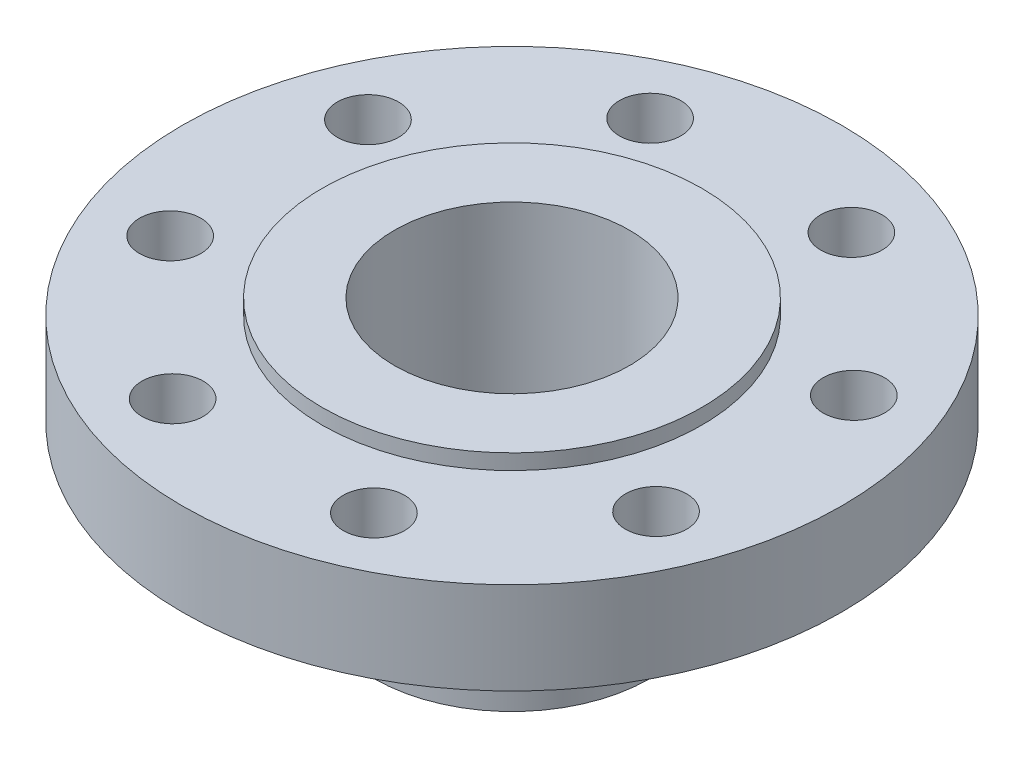
ISO-10303-21;
HEADER;
FILE_DESCRIPTION(('STEP AP214'),'2;1');
FILE_NAME('part.step','',(''),(''),'','','');
FILE_SCHEMA(('AUTOMOTIVE_DESIGN { 1 0 10303 214 1 1 1 1 }'));
ENDSEC;
DATA;
#1=APPLICATION_CONTEXT('core data for automotive mechanical design processes');
#2=APPLICATION_PROTOCOL_DEFINITION('international standard','automotive_design',2000,#1);
#3=PRODUCT_CONTEXT('',#1,'mechanical');
#4=PRODUCT('Part','Part','',(#3));
#5=PRODUCT_RELATED_PRODUCT_CATEGORY('part','',(#4));
#6=PRODUCT_DEFINITION_FORMATION('','',#4);
#7=PRODUCT_DEFINITION_CONTEXT('part definition',#1,'design');
#8=PRODUCT_DEFINITION('design','',#6,#7);
#9=PRODUCT_DEFINITION_SHAPE('','',#8);
#10=(LENGTH_UNIT() NAMED_UNIT(*) SI_UNIT(.MILLI.,.METRE.));
#11=(NAMED_UNIT(*) PLANE_ANGLE_UNIT() SI_UNIT($,.RADIAN.));
#12=(NAMED_UNIT(*) SI_UNIT($,.STERADIAN.) SOLID_ANGLE_UNIT());
#13=UNCERTAINTY_MEASURE_WITH_UNIT(LENGTH_MEASURE(1.E-05),#10,'distance_accuracy_value','');
#14=(GEOMETRIC_REPRESENTATION_CONTEXT(3) GLOBAL_UNCERTAINTY_ASSIGNED_CONTEXT((#13)) GLOBAL_UNIT_ASSIGNED_CONTEXT((#10,
#11,#12)) REPRESENTATION_CONTEXT('',''));
#15=CARTESIAN_POINT('',(0.,0.,0.));
#16=DIRECTION('',(0.,0.,1.));
#17=DIRECTION('',(1.,0.,0.));
#18=AXIS2_PLACEMENT_3D('',#15,#16,#17);
#19=CARTESIAN_POINT('',(57.15,0.,0.));
#20=DIRECTION('',(0.,1.,0.));
#21=DIRECTION('',(0.,0.,1.));
#22=AXIS2_PLACEMENT_3D('',#19,#20,#21);
#23=PLANE('',#22);
#24=CARTESIAN_POINT('',(0.,0.,0.));
#25=DIRECTION('',(0.,1.,0.));
#26=DIRECTION('',(0.,0.,1.));
#27=AXIS2_PLACEMENT_3D('',#24,#25,#26);
#28=CIRCLE('',#27,57.15);
#29=CARTESIAN_POINT('',(0.,0.,57.15));
#30=VERTEX_POINT('',#29);
#31=EDGE_CURVE('E70',#30,#30,#28,.T.);
#32=ORIENTED_EDGE('',*,*,#31,.F.);
#33=EDGE_LOOP('',(#32));
#34=FACE_BOUND('',#33,.T.);
#35=CARTESIAN_POINT('',(0.,0.,0.));
#36=DIRECTION('',(0.,1.,0.));
#37=DIRECTION('',(0.,0.,1.));
#38=AXIS2_PLACEMENT_3D('',#35,#36,#37);
#39=CIRCLE('',#38,48.64);
#40=CARTESIAN_POINT('',(0.,0.,48.64));
#41=VERTEX_POINT('',#40);
#42=EDGE_CURVE('E10',#41,#41,#39,.T.);
#43=ORIENTED_EDGE('',*,*,#42,.T.);
#44=EDGE_LOOP('',(#43));
#45=FACE_BOUND('',#44,.T.);
#46=ADVANCED_FACE('F31',(#34,#45),#23,.F.);
#47=CARTESIAN_POINT('',(0.,145.426192893401,0.));
#48=DIRECTION('',(0.,1.,0.));
#49=DIRECTION('',(0.,0.,1.));
#50=AXIS2_PLACEMENT_3D('',#47,#48,#49);
#51=CYLINDRICAL_SURFACE('',#50,48.64);
#52=ORIENTED_EDGE('',*,*,#42,.F.);
#53=EDGE_LOOP('',(#52));
#54=FACE_BOUND('',#53,.T.);
#55=CARTESIAN_POINT('',(0.,107.95,0.));
#56=DIRECTION('',(0.,1.,0.));
#57=DIRECTION('',(0.,0.,1.));
#58=AXIS2_PLACEMENT_3D('',#55,#56,#57);
#59=CIRCLE('',#58,48.64);
#60=CARTESIAN_POINT('',(0.,107.95,48.64));
#61=VERTEX_POINT('',#60);
#62=EDGE_CURVE('E38',#61,#61,#59,.T.);
#63=ORIENTED_EDGE('',*,*,#62,.T.);
#64=EDGE_LOOP('',(#63));
#65=FACE_BOUND('',#64,.T.);
#66=ADVANCED_FACE('F141',(#54,#65),#51,.F.);
#67=CARTESIAN_POINT('',(48.64,107.95,0.));
#68=DIRECTION('',(0.,-1.,0.));
#69=DIRECTION('',(0.,0.,-1.));
#70=AXIS2_PLACEMENT_3D('',#67,#68,#69);
#71=PLANE('',#70);
#72=ORIENTED_EDGE('',*,*,#62,.F.);
#73=EDGE_LOOP('',(#72));
#74=FACE_BOUND('',#73,.T.);
#75=CARTESIAN_POINT('',(0.,107.95,0.));
#76=DIRECTION('',(0.,1.,0.));
#77=DIRECTION('',(0.,0.,1.));
#78=AXIS2_PLACEMENT_3D('',#75,#76,#77);
#79=CIRCLE('',#78,78.615);
#80=CARTESIAN_POINT('',(0.,107.95,78.615));
#81=VERTEX_POINT('',#80);
#82=EDGE_CURVE('E43',#81,#81,#79,.T.);
#83=ORIENTED_EDGE('',*,*,#82,.T.);
#84=EDGE_LOOP('',(#83));
#85=FACE_BOUND('',#84,.T.);
#86=ADVANCED_FACE('F97',(#74,#85),#71,.F.);
#87=CARTESIAN_POINT('',(0.,145.426192893401,0.));
#88=DIRECTION('',(0.,1.,0.));
#89=DIRECTION('',(0.,0.,1.));
#90=AXIS2_PLACEMENT_3D('',#87,#88,#89);
#91=CYLINDRICAL_SURFACE('',#90,78.615);
#92=ORIENTED_EDGE('',*,*,#82,.F.);
#93=EDGE_LOOP('',(#92));
#94=FACE_BOUND('',#93,.T.);
#95=CARTESIAN_POINT('',(0.,101.6,0.));
#96=DIRECTION('',(0.,1.,0.));
#97=DIRECTION('',(0.,0.,1.));
#98=AXIS2_PLACEMENT_3D('',#95,#96,#97);
#99=CIRCLE('',#98,78.615);
#100=CARTESIAN_POINT('',(0.,101.6,78.615));
#101=VERTEX_POINT('',#100);
#102=EDGE_CURVE('E92',#101,#101,#99,.T.);
#103=ORIENTED_EDGE('',*,*,#102,.T.);
#104=EDGE_LOOP('',(#103));
#105=FACE_BOUND('',#104,.T.);
#106=ADVANCED_FACE('F99',(#94,#105),#91,.T.);
#107=CARTESIAN_POINT('',(78.615,101.6,0.));
#108=DIRECTION('',(0.,-1.,0.));
#109=DIRECTION('',(0.,0.,-1.));
#110=AXIS2_PLACEMENT_3D('',#107,#108,#109);
#111=PLANE('',#110);
#112=CARTESIAN_POINT('',(-100.089497100485,101.6,-40.4387817592463));
#113=DIRECTION('',(0.,1.,0.));
#114=DIRECTION('',(0.,0.,1.));
#115=AXIS2_PLACEMENT_3D('',#112,#113,#114);
#116=CIRCLE('',#115,12.7000000000027);
#117=CARTESIAN_POINT('',(-100.089497100485,101.6,-27.7387817592436));
#118=VERTEX_POINT('',#117);
#119=EDGE_CURVE('E262',#118,#118,#116,.T.);
#120=ORIENTED_EDGE('',*,*,#119,.F.);
#121=EDGE_LOOP('',(#120));
#122=FACE_BOUND('',#121,.T.);
#123=CARTESIAN_POINT('',(-99.3684989301908,101.6,42.1794253204198));
#124=DIRECTION('',(0.,1.,0.));
#125=DIRECTION('',(0.,0.,1.));
#126=AXIS2_PLACEMENT_3D('',#123,#124,#125);
#127=CIRCLE('',#126,12.7000000000036);
#128=CARTESIAN_POINT('',(-99.3684989301908,101.6,54.8794253204234));
#129=VERTEX_POINT('',#128);
#130=EDGE_CURVE('E263',#129,#129,#127,.T.);
#131=ORIENTED_EDGE('',*,*,#130,.F.);
#132=EDGE_LOOP('',(#131));
#133=FACE_BOUND('',#132,.T.);
#134=CARTESIAN_POINT('',(-40.4387817592463,101.6,100.089497100488));
#135=DIRECTION('',(0.,1.,0.));
#136=DIRECTION('',(0.,0.,1.));
#137=AXIS2_PLACEMENT_3D('',#134,#135,#136);
#138=CIRCLE('',#137,12.7000000000036);
#139=CARTESIAN_POINT('',(-40.4387817592463,101.6,112.789497100491));
#140=VERTEX_POINT('',#139);
#141=EDGE_CURVE('E265',#140,#140,#138,.T.);
#142=ORIENTED_EDGE('',*,*,#141,.F.);
#143=EDGE_LOOP('',(#142));
#144=FACE_BOUND('',#143,.T.);
#145=CARTESIAN_POINT('',(42.1794253204198,101.6,99.3684989301934));
#146=DIRECTION('',(0.,1.,0.));
#147=DIRECTION('',(0.,0.,1.));
#148=AXIS2_PLACEMENT_3D('',#145,#146,#147);
#149=CIRCLE('',#148,12.7000000000025);
#150=CARTESIAN_POINT('',(42.1794253204198,101.6,112.068498930196));
#151=VERTEX_POINT('',#150);
#152=EDGE_CURVE('E270',#151,#151,#149,.T.);
#153=ORIENTED_EDGE('',*,*,#152,.F.);
#154=EDGE_LOOP('',(#153));
#155=FACE_BOUND('',#154,.T.);
#156=CARTESIAN_POINT('',(100.089497100488,101.6,40.4387817592488));
#157=DIRECTION('',(0.,1.,0.));
#158=DIRECTION('',(0.,0.,1.));
#159=AXIS2_PLACEMENT_3D('',#156,#157,#158);
#160=CIRCLE('',#159,12.7000000000009);
#161=CARTESIAN_POINT('',(100.089497100488,101.6,53.1387817592498));
#162=VERTEX_POINT('',#161);
#163=EDGE_CURVE('E273',#162,#162,#160,.T.);
#164=ORIENTED_EDGE('',*,*,#163,.F.);
#165=EDGE_LOOP('',(#164));
#166=FACE_BOUND('',#165,.T.);
#167=CARTESIAN_POINT('',(99.3684989301935,101.6,-42.1794253204172));
#168=DIRECTION('',(0.,1.,0.));
#169=DIRECTION('',(0.,0.,1.));
#170=AXIS2_PLACEMENT_3D('',#167,#168,#169);
#171=CIRCLE('',#170,12.6999999999997);
#172=CARTESIAN_POINT('',(99.3684989301935,101.6,-29.4794253204176));
#173=VERTEX_POINT('',#172);
#174=EDGE_CURVE('E276',#173,#173,#171,.T.);
#175=ORIENTED_EDGE('',*,*,#174,.F.);
#176=EDGE_LOOP('',(#175));
#177=FACE_BOUND('',#176,.T.);
#178=CARTESIAN_POINT('',(40.4387817592489,101.6,-100.089497100485));
#179=DIRECTION('',(0.,1.,0.));
#180=DIRECTION('',(0.,0.,1.));
#181=AXIS2_PLACEMENT_3D('',#178,#179,#180);
#182=CIRCLE('',#181,12.6999999999993);
#183=CARTESIAN_POINT('',(40.4387817592489,101.6,-87.389497100486));
#184=VERTEX_POINT('',#183);
#185=EDGE_CURVE('E279',#184,#184,#182,.T.);
#186=ORIENTED_EDGE('',*,*,#185,.F.);
#187=EDGE_LOOP('',(#186));
#188=FACE_BOUND('',#187,.T.);
#189=CARTESIAN_POINT('',(-42.1794253204172,101.6,-99.3684989301909));
#190=DIRECTION('',(0.,1.,0.));
#191=DIRECTION('',(0.,0.,1.));
#192=AXIS2_PLACEMENT_3D('',#189,#190,#191);
#193=CIRCLE('',#192,12.7);
#194=CARTESIAN_POINT('',(-42.1794253204172,101.6,-86.6684989301909));
#195=VERTEX_POINT('',#194);
#196=EDGE_CURVE('E51',#195,#195,#193,.T.);
#197=ORIENTED_EDGE('',*,*,#196,.F.);
#198=EDGE_LOOP('',(#197));
#199=FACE_BOUND('',#198,.T.);
#200=ORIENTED_EDGE('',*,*,#102,.F.);
#201=EDGE_LOOP('',(#200));
#202=FACE_BOUND('',#201,.T.);
#203=CARTESIAN_POINT('',(0.,101.6,0.));
#204=DIRECTION('',(0.,1.,0.));
#205=DIRECTION('',(0.,0.,1.));
#206=AXIS2_PLACEMENT_3D('',#203,#204,#205);
#207=CIRCLE('',#206,136.525);
#208=CARTESIAN_POINT('',(0.,101.6,136.525));
#209=VERTEX_POINT('',#208);
#210=EDGE_CURVE('E89',#209,#209,#207,.T.);
#211=ORIENTED_EDGE('',*,*,#210,.T.);
#212=EDGE_LOOP('',(#211));
#213=FACE_BOUND('',#212,.T.);
#214=ADVANCED_FACE('F102',(#122,#133,#144,#155,#166,#177,#188,#199,#202,#213),#111,.F.);
#215=CARTESIAN_POINT('',(0.,145.426192893401,0.));
#216=DIRECTION('',(0.,1.,0.));
#217=DIRECTION('',(0.,0.,1.));
#218=AXIS2_PLACEMENT_3D('',#215,#216,#217);
#219=CYLINDRICAL_SURFACE('',#218,136.525);
#220=ORIENTED_EDGE('',*,*,#210,.F.);
#221=EDGE_LOOP('',(#220));
#222=FACE_BOUND('',#221,.T.);
#223=CARTESIAN_POINT('',(0.,63.5,0.));
#224=DIRECTION('',(0.,1.,0.));
#225=DIRECTION('',(0.,0.,1.));
#226=AXIS2_PLACEMENT_3D('',#223,#224,#225);
#227=CIRCLE('',#226,136.525);
#228=CARTESIAN_POINT('',(0.,63.5,136.525));
#229=VERTEX_POINT('',#228);
#230=EDGE_CURVE('E86',#229,#229,#227,.T.);
#231=ORIENTED_EDGE('',*,*,#230,.T.);
#232=EDGE_LOOP('',(#231));
#233=FACE_BOUND('',#232,.T.);
#234=ADVANCED_FACE('F108',(#222,#233),#219,.T.);
#235=CARTESIAN_POINT('',(136.525,63.5,0.));
#236=DIRECTION('',(0.,1.,0.));
#237=DIRECTION('',(0.,0.,1.));
#238=AXIS2_PLACEMENT_3D('',#235,#236,#237);
#239=PLANE('',#238);
#240=CARTESIAN_POINT('',(-100.089497100485,63.5,-40.4387817592463));
#241=DIRECTION('',(0.,1.,0.));
#242=DIRECTION('',(0.,0.,1.));
#243=AXIS2_PLACEMENT_3D('',#240,#241,#242);
#244=CIRCLE('',#243,12.7000000000027);
#245=CARTESIAN_POINT('',(-100.089497100485,63.5,-27.7387817592436));
#246=VERTEX_POINT('',#245);
#247=EDGE_CURVE('E34',#246,#246,#244,.T.);
#248=ORIENTED_EDGE('',*,*,#247,.T.);
#249=EDGE_LOOP('',(#248));
#250=FACE_BOUND('',#249,.T.);
#251=CARTESIAN_POINT('',(-99.3684989301908,63.5,42.1794253204198));
#252=DIRECTION('',(0.,1.,0.));
#253=DIRECTION('',(0.,0.,1.));
#254=AXIS2_PLACEMENT_3D('',#251,#252,#253);
#255=CIRCLE('',#254,12.7000000000036);
#256=CARTESIAN_POINT('',(-99.3684989301908,63.5,54.8794253204234));
#257=VERTEX_POINT('',#256);
#258=EDGE_CURVE('E65',#257,#257,#255,.T.);
#259=ORIENTED_EDGE('',*,*,#258,.T.);
#260=EDGE_LOOP('',(#259));
#261=FACE_BOUND('',#260,.T.);
#262=CARTESIAN_POINT('',(-40.4387817592463,63.5,100.089497100488));
#263=DIRECTION('',(0.,1.,0.));
#264=DIRECTION('',(0.,0.,1.));
#265=AXIS2_PLACEMENT_3D('',#262,#263,#264);
#266=CIRCLE('',#265,12.7000000000036);
#267=CARTESIAN_POINT('',(-40.4387817592463,63.5,112.789497100491));
#268=VERTEX_POINT('',#267);
#269=EDGE_CURVE('E63',#268,#268,#266,.T.);
#270=ORIENTED_EDGE('',*,*,#269,.T.);
#271=EDGE_LOOP('',(#270));
#272=FACE_BOUND('',#271,.T.);
#273=CARTESIAN_POINT('',(42.1794253204198,63.5,99.3684989301934));
#274=DIRECTION('',(0.,1.,0.));
#275=DIRECTION('',(0.,0.,1.));
#276=AXIS2_PLACEMENT_3D('',#273,#274,#275);
#277=CIRCLE('',#276,12.7000000000025);
#278=CARTESIAN_POINT('',(42.1794253204198,63.5,112.068498930196));
#279=VERTEX_POINT('',#278);
#280=EDGE_CURVE('E60',#279,#279,#277,.T.);
#281=ORIENTED_EDGE('',*,*,#280,.T.);
#282=EDGE_LOOP('',(#281));
#283=FACE_BOUND('',#282,.T.);
#284=CARTESIAN_POINT('',(100.089497100488,63.5,40.4387817592488));
#285=DIRECTION('',(0.,1.,0.));
#286=DIRECTION('',(0.,0.,1.));
#287=AXIS2_PLACEMENT_3D('',#284,#285,#286);
#288=CIRCLE('',#287,12.7000000000009);
#289=CARTESIAN_POINT('',(100.089497100488,63.5,53.1387817592498));
#290=VERTEX_POINT('',#289);
#291=EDGE_CURVE('E57',#290,#290,#288,.T.);
#292=ORIENTED_EDGE('',*,*,#291,.T.);
#293=EDGE_LOOP('',(#292));
#294=FACE_BOUND('',#293,.T.);
#295=CARTESIAN_POINT('',(99.3684989301935,63.5,-42.1794253204172));
#296=DIRECTION('',(0.,1.,0.));
#297=DIRECTION('',(0.,0.,1.));
#298=AXIS2_PLACEMENT_3D('',#295,#296,#297);
#299=CIRCLE('',#298,12.6999999999997);
#300=CARTESIAN_POINT('',(99.3684989301935,63.5,-29.4794253204176));
#301=VERTEX_POINT('',#300);
#302=EDGE_CURVE('E54',#301,#301,#299,.T.);
#303=ORIENTED_EDGE('',*,*,#302,.T.);
#304=EDGE_LOOP('',(#303));
#305=FACE_BOUND('',#304,.T.);
#306=CARTESIAN_POINT('',(40.4387817592489,63.5,-100.089497100485));
#307=DIRECTION('',(0.,1.,0.));
#308=DIRECTION('',(0.,0.,1.));
#309=AXIS2_PLACEMENT_3D('',#306,#307,#308);
#310=CIRCLE('',#309,12.6999999999993);
#311=CARTESIAN_POINT('',(40.4387817592489,63.5,-87.389497100486));
#312=VERTEX_POINT('',#311);
#313=EDGE_CURVE('E50',#312,#312,#310,.T.);
#314=ORIENTED_EDGE('',*,*,#313,.T.);
#315=EDGE_LOOP('',(#314));
#316=FACE_BOUND('',#315,.T.);
#317=CARTESIAN_POINT('',(-42.1794253204172,63.5,-99.3684989301909));
#318=DIRECTION('',(0.,1.,0.));
#319=DIRECTION('',(0.,0.,1.));
#320=AXIS2_PLACEMENT_3D('',#317,#318,#319);
#321=CIRCLE('',#320,12.7);
#322=CARTESIAN_POINT('',(-42.1794253204172,63.5,-86.6684989301909));
#323=VERTEX_POINT('',#322);
#324=EDGE_CURVE('E47',#323,#323,#321,.T.);
#325=ORIENTED_EDGE('',*,*,#324,.T.);
#326=EDGE_LOOP('',(#325));
#327=FACE_BOUND('',#326,.T.);
#328=ORIENTED_EDGE('',*,*,#230,.F.);
#329=EDGE_LOOP('',(#328));
#330=FACE_BOUND('',#329,.T.);
#331=CARTESIAN_POINT('',(0.,63.5,0.));
#332=DIRECTION('',(0.,1.,0.));
#333=DIRECTION('',(0.,0.,1.));
#334=AXIS2_PLACEMENT_3D('',#331,#332,#333);
#335=CIRCLE('',#334,78.615);
#336=CARTESIAN_POINT('',(0.,63.5,78.615));
#337=VERTEX_POINT('',#336);
#338=EDGE_CURVE('E79',#337,#337,#335,.T.);
#339=ORIENTED_EDGE('',*,*,#338,.T.);
#340=EDGE_LOOP('',(#339));
#341=FACE_BOUND('',#340,.T.);
#342=ADVANCED_FACE('F115',(#250,#261,#272,#283,#294,#305,#316,#327,#330,#341),#239,.F.);
#343=CARTESIAN_POINT('',(0.,11.29,0.));
#344=DIRECTION('',(0.,1.,0.));
#345=DIRECTION('',(0.,0.,1.));
#346=AXIS2_PLACEMENT_3D('',#343,#344,#345);
#347=CONICAL_SURFACE('',#346,57.15,0.390062635975593);
#348=ORIENTED_EDGE('',*,*,#338,.F.);
#349=EDGE_LOOP('',(#348));
#350=FACE_BOUND('',#349,.T.);
#351=CARTESIAN_POINT('',(0.,11.29,0.));
#352=DIRECTION('',(0.,1.,0.));
#353=DIRECTION('',(0.,0.,1.));
#354=AXIS2_PLACEMENT_3D('',#351,#352,#353);
#355=CIRCLE('',#354,57.15);
#356=CARTESIAN_POINT('',(0.,11.29,57.15));
#357=VERTEX_POINT('',#356);
#358=EDGE_CURVE('E74',#357,#357,#355,.T.);
#359=ORIENTED_EDGE('',*,*,#358,.T.);
#360=EDGE_LOOP('',(#359));
#361=FACE_BOUND('',#360,.T.);
#362=ADVANCED_FACE('F121',(#350,#361),#347,.T.);
#363=CARTESIAN_POINT('',(0.,145.426192893401,0.));
#364=DIRECTION('',(0.,1.,0.));
#365=DIRECTION('',(0.,0.,1.));
#366=AXIS2_PLACEMENT_3D('',#363,#364,#365);
#367=CYLINDRICAL_SURFACE('',#366,57.15);
#368=ORIENTED_EDGE('',*,*,#358,.F.);
#369=EDGE_LOOP('',(#368));
#370=FACE_BOUND('',#369,.T.);
#371=ORIENTED_EDGE('',*,*,#31,.T.);
#372=EDGE_LOOP('',(#371));
#373=FACE_BOUND('',#372,.T.);
#374=ADVANCED_FACE('F127',(#370,#373),#367,.T.);
#375=CARTESIAN_POINT('',(-42.1794253204172,48.6,-99.3684989301909));
#376=DIRECTION('',(0.,1.,0.));
#377=DIRECTION('',(0.,0.,1.));
#378=AXIS2_PLACEMENT_3D('',#375,#376,#377);
#379=CYLINDRICAL_SURFACE('',#378,12.7);
#380=ORIENTED_EDGE('',*,*,#196,.T.);
#381=EDGE_LOOP('',(#380));
#382=FACE_BOUND('',#381,.T.);
#383=ORIENTED_EDGE('',*,*,#324,.F.);
#384=EDGE_LOOP('',(#383));
#385=FACE_BOUND('',#384,.T.);
#386=ADVANCED_FACE('F132',(#382,#385),#379,.F.);
#387=CARTESIAN_POINT('',(40.4387817592489,48.6,-100.089497100485));
#388=DIRECTION('',(0.,1.,0.));
#389=DIRECTION('',(0.,0.,1.));
#390=AXIS2_PLACEMENT_3D('',#387,#388,#389);
#391=CYLINDRICAL_SURFACE('',#390,12.6999999999993);
#392=ORIENTED_EDGE('',*,*,#185,.T.);
#393=EDGE_LOOP('',(#392));
#394=FACE_BOUND('',#393,.T.);
#395=ORIENTED_EDGE('',*,*,#313,.F.);
#396=EDGE_LOOP('',(#395));
#397=FACE_BOUND('',#396,.T.);
#398=ADVANCED_FACE('F137',(#394,#397),#391,.F.);
#399=CARTESIAN_POINT('',(99.3684989301935,48.6,-42.1794253204172));
#400=DIRECTION('',(0.,1.,0.));
#401=DIRECTION('',(0.,0.,1.));
#402=AXIS2_PLACEMENT_3D('',#399,#400,#401);
#403=CYLINDRICAL_SURFACE('',#402,12.6999999999997);
#404=ORIENTED_EDGE('',*,*,#174,.T.);
#405=EDGE_LOOP('',(#404));
#406=FACE_BOUND('',#405,.T.);
#407=ORIENTED_EDGE('',*,*,#302,.F.);
#408=EDGE_LOOP('',(#407));
#409=FACE_BOUND('',#408,.T.);
#410=ADVANCED_FACE('F195',(#406,#409),#403,.F.);
#411=CARTESIAN_POINT('',(100.089497100488,48.6,40.4387817592488));
#412=DIRECTION('',(0.,1.,0.));
#413=DIRECTION('',(0.,0.,1.));
#414=AXIS2_PLACEMENT_3D('',#411,#412,#413);
#415=CYLINDRICAL_SURFACE('',#414,12.7000000000009);
#416=ORIENTED_EDGE('',*,*,#163,.T.);
#417=EDGE_LOOP('',(#416));
#418=FACE_BOUND('',#417,.T.);
#419=ORIENTED_EDGE('',*,*,#291,.F.);
#420=EDGE_LOOP('',(#419));
#421=FACE_BOUND('',#420,.T.);
#422=ADVANCED_FACE('F204',(#418,#421),#415,.F.);
#423=CARTESIAN_POINT('',(42.1794253204198,48.6,99.3684989301934));
#424=DIRECTION('',(0.,1.,0.));
#425=DIRECTION('',(0.,0.,1.));
#426=AXIS2_PLACEMENT_3D('',#423,#424,#425);
#427=CYLINDRICAL_SURFACE('',#426,12.7000000000025);
#428=ORIENTED_EDGE('',*,*,#152,.T.);
#429=EDGE_LOOP('',(#428));
#430=FACE_BOUND('',#429,.T.);
#431=ORIENTED_EDGE('',*,*,#280,.F.);
#432=EDGE_LOOP('',(#431));
#433=FACE_BOUND('',#432,.T.);
#434=ADVANCED_FACE('F213',(#430,#433),#427,.F.);
#435=CARTESIAN_POINT('',(-40.4387817592463,48.6,100.089497100488));
#436=DIRECTION('',(0.,1.,0.));
#437=DIRECTION('',(0.,0.,1.));
#438=AXIS2_PLACEMENT_3D('',#435,#436,#437);
#439=CYLINDRICAL_SURFACE('',#438,12.7000000000036);
#440=ORIENTED_EDGE('',*,*,#141,.T.);
#441=EDGE_LOOP('',(#440));
#442=FACE_BOUND('',#441,.T.);
#443=ORIENTED_EDGE('',*,*,#269,.F.);
#444=EDGE_LOOP('',(#443));
#445=FACE_BOUND('',#444,.T.);
#446=ADVANCED_FACE('F222',(#442,#445),#439,.F.);
#447=CARTESIAN_POINT('',(-99.3684989301908,48.6,42.1794253204198));
#448=DIRECTION('',(0.,1.,0.));
#449=DIRECTION('',(0.,0.,1.));
#450=AXIS2_PLACEMENT_3D('',#447,#448,#449);
#451=CYLINDRICAL_SURFACE('',#450,12.7000000000036);
#452=ORIENTED_EDGE('',*,*,#130,.T.);
#453=EDGE_LOOP('',(#452));
#454=FACE_BOUND('',#453,.T.);
#455=ORIENTED_EDGE('',*,*,#258,.F.);
#456=EDGE_LOOP('',(#455));
#457=FACE_BOUND('',#456,.T.);
#458=ADVANCED_FACE('F231',(#454,#457),#451,.F.);
#459=CARTESIAN_POINT('',(-100.089497100485,48.6,-40.4387817592463));
#460=DIRECTION('',(0.,1.,0.));
#461=DIRECTION('',(0.,0.,1.));
#462=AXIS2_PLACEMENT_3D('',#459,#460,#461);
#463=CYLINDRICAL_SURFACE('',#462,12.7000000000027);
#464=ORIENTED_EDGE('',*,*,#119,.T.);
#465=EDGE_LOOP('',(#464));
#466=FACE_BOUND('',#465,.T.);
#467=ORIENTED_EDGE('',*,*,#247,.F.);
#468=EDGE_LOOP('',(#467));
#469=FACE_BOUND('',#468,.T.);
#470=ADVANCED_FACE('F240',(#466,#469),#463,.F.);
#471=CLOSED_SHELL('',(#46,#66,#86,#106,#214,#234,#342,#362,#374,#386,#398,#410,#422,#434,#446,
#458,#470));
#472=MANIFOLD_SOLID_BREP('B2',#471);
#473=ADVANCED_BREP_SHAPE_REPRESENTATION('',(#18,#472),#14);
#474=SHAPE_DEFINITION_REPRESENTATION(#9,#473);
ENDSEC;
END-ISO-10303-21;
